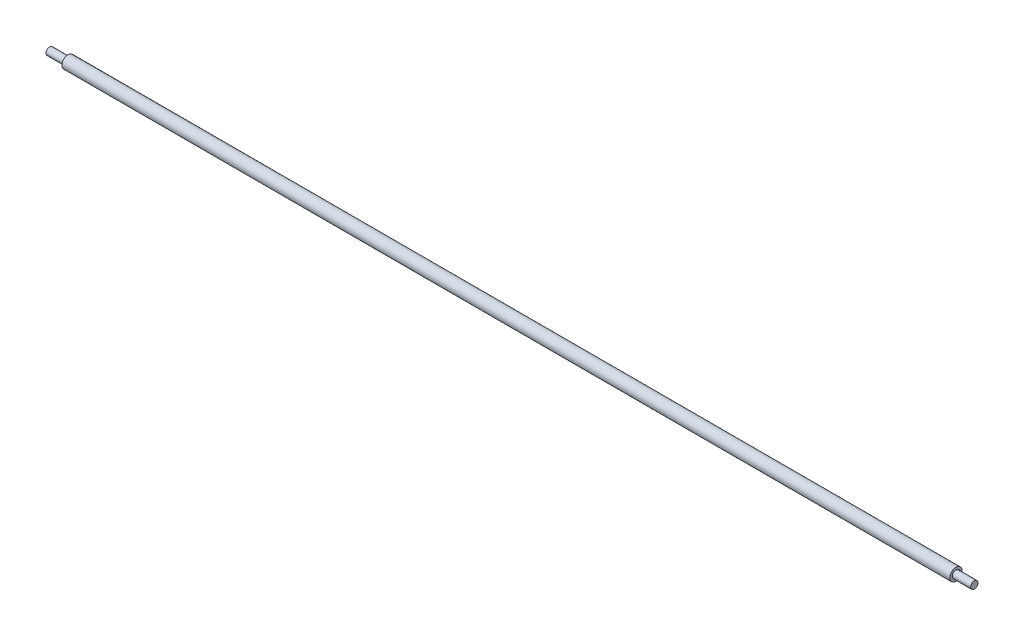
ISO-10303-21;
HEADER;
FILE_DESCRIPTION(('STEP AP214'),'2;1');
FILE_NAME('part.step','',(''),(''),'','','');
FILE_SCHEMA(('AUTOMOTIVE_DESIGN { 1 0 10303 214 1 1 1 1 }'));
ENDSEC;
DATA;
#1=APPLICATION_CONTEXT('core data for automotive mechanical design processes');
#2=APPLICATION_PROTOCOL_DEFINITION('international standard','automotive_design',2000,#1);
#3=PRODUCT_CONTEXT('',#1,'mechanical');
#4=PRODUCT('Part','Part','',(#3));
#5=PRODUCT_RELATED_PRODUCT_CATEGORY('part','',(#4));
#6=PRODUCT_DEFINITION_FORMATION('','',#4);
#7=PRODUCT_DEFINITION_CONTEXT('part definition',#1,'design');
#8=PRODUCT_DEFINITION('design','',#6,#7);
#9=PRODUCT_DEFINITION_SHAPE('','',#8);
#10=(LENGTH_UNIT() NAMED_UNIT(*) SI_UNIT(.MILLI.,.METRE.));
#11=(NAMED_UNIT(*) PLANE_ANGLE_UNIT() SI_UNIT($,.RADIAN.));
#12=(NAMED_UNIT(*) SI_UNIT($,.STERADIAN.) SOLID_ANGLE_UNIT());
#13=UNCERTAINTY_MEASURE_WITH_UNIT(LENGTH_MEASURE(1.E-05),#10,'distance_accuracy_value','');
#14=(GEOMETRIC_REPRESENTATION_CONTEXT(3) GLOBAL_UNCERTAINTY_ASSIGNED_CONTEXT((#13)) GLOBAL_UNIT_ASSIGNED_CONTEXT((#10,
#11,#12)) REPRESENTATION_CONTEXT('',''));
#15=CARTESIAN_POINT('',(0.,0.,0.));
#16=DIRECTION('',(0.,0.,1.));
#17=DIRECTION('',(1.,0.,0.));
#18=AXIS2_PLACEMENT_3D('',#15,#16,#17);
#19=CARTESIAN_POINT('',(-270.,0.,0.));
#20=DIRECTION('',(1.,0.,0.));
#21=DIRECTION('',(0.,0.,-1.));
#22=AXIS2_PLACEMENT_3D('',#19,#20,#21);
#23=CYLINDRICAL_SURFACE('',#22,5.);
#24=CARTESIAN_POINT('',(-270.,0.,0.));
#25=DIRECTION('',(1.,0.,0.));
#26=DIRECTION('',(0.,0.,-1.));
#27=AXIS2_PLACEMENT_3D('',#24,#25,#26);
#28=CIRCLE('',#27,5.);
#29=CARTESIAN_POINT('',(-270.,0.,-5.));
#30=VERTEX_POINT('',#29);
#31=EDGE_CURVE('E36',#30,#30,#28,.T.);
#32=ORIENTED_EDGE('',*,*,#31,.T.);
#33=EDGE_LOOP('',(#32));
#34=FACE_BOUND('',#33,.T.);
#35=CARTESIAN_POINT('',(455.,0.,0.));
#36=DIRECTION('',(1.,0.,0.));
#37=DIRECTION('',(0.,0.,-1.));
#38=AXIS2_PLACEMENT_3D('',#35,#36,#37);
#39=CIRCLE('',#38,5.);
#40=CARTESIAN_POINT('',(455.,0.,-5.));
#41=VERTEX_POINT('',#40);
#42=EDGE_CURVE('E51',#41,#41,#39,.T.);
#43=ORIENTED_EDGE('',*,*,#42,.F.);
#44=EDGE_LOOP('',(#43));
#45=FACE_BOUND('',#44,.T.);
#46=ADVANCED_FACE('F33',(#34,#45),#23,.T.);
#47=CARTESIAN_POINT('',(-270.,0.,0.));
#48=DIRECTION('',(1.,0.,0.));
#49=DIRECTION('',(0.,0.,-1.));
#50=AXIS2_PLACEMENT_3D('',#47,#48,#49);
#51=PLANE('',#50);
#52=CARTESIAN_POINT('',(-270.,0.,0.));
#53=DIRECTION('',(-1.,0.,0.));
#54=DIRECTION('',(0.,0.,1.));
#55=AXIS2_PLACEMENT_3D('',#52,#53,#54);
#56=CIRCLE('',#55,3.);
#57=CARTESIAN_POINT('',(-270.,0.,3.));
#58=VERTEX_POINT('',#57);
#59=EDGE_CURVE('E40',#58,#58,#56,.T.);
#60=ORIENTED_EDGE('',*,*,#59,.F.);
#61=EDGE_LOOP('',(#60));
#62=FACE_BOUND('',#61,.T.);
#63=ORIENTED_EDGE('',*,*,#31,.F.);
#64=EDGE_LOOP('',(#63));
#65=FACE_BOUND('',#64,.T.);
#66=ADVANCED_FACE('F60',(#62,#65),#51,.F.);
#67=CARTESIAN_POINT('',(455.,0.,0.));
#68=DIRECTION('',(1.,0.,0.));
#69=DIRECTION('',(0.,0.,-1.));
#70=AXIS2_PLACEMENT_3D('',#67,#68,#69);
#71=PLANE('',#70);
#72=CARTESIAN_POINT('',(455.,0.,0.));
#73=DIRECTION('',(1.,0.,0.));
#74=DIRECTION('',(0.,0.,-1.));
#75=AXIS2_PLACEMENT_3D('',#72,#73,#74);
#76=CIRCLE('',#75,3.);
#77=CARTESIAN_POINT('',(455.,0.,-3.));
#78=VERTEX_POINT('',#77);
#79=EDGE_CURVE('E10',#78,#78,#76,.T.);
#80=ORIENTED_EDGE('',*,*,#79,.F.);
#81=EDGE_LOOP('',(#80));
#82=FACE_BOUND('',#81,.T.);
#83=ORIENTED_EDGE('',*,*,#42,.T.);
#84=EDGE_LOOP('',(#83));
#85=FACE_BOUND('',#84,.T.);
#86=ADVANCED_FACE('F62',(#82,#85),#71,.T.);
#87=CARTESIAN_POINT('',(-285.,0.,0.));
#88=DIRECTION('',(1.,0.,0.));
#89=DIRECTION('',(0.,0.,-1.));
#90=AXIS2_PLACEMENT_3D('',#87,#88,#89);
#91=CYLINDRICAL_SURFACE('',#90,3.);
#92=CARTESIAN_POINT('',(-285.,0.,0.));
#93=DIRECTION('',(-1.,0.,0.));
#94=DIRECTION('',(0.,0.,1.));
#95=AXIS2_PLACEMENT_3D('',#92,#93,#94);
#96=CIRCLE('',#95,3.);
#97=CARTESIAN_POINT('',(-285.,0.,3.));
#98=VERTEX_POINT('',#97);
#99=EDGE_CURVE('E49',#98,#98,#96,.T.);
#100=ORIENTED_EDGE('',*,*,#99,.F.);
#101=EDGE_LOOP('',(#100));
#102=FACE_BOUND('',#101,.T.);
#103=ORIENTED_EDGE('',*,*,#59,.T.);
#104=EDGE_LOOP('',(#103));
#105=FACE_BOUND('',#104,.T.);
#106=ADVANCED_FACE('F68',(#102,#105),#91,.T.);
#107=CARTESIAN_POINT('',(-285.,0.,0.));
#108=DIRECTION('',(-1.,0.,0.));
#109=DIRECTION('',(0.,0.,1.));
#110=AXIS2_PLACEMENT_3D('',#107,#108,#109);
#111=PLANE('',#110);
#112=ORIENTED_EDGE('',*,*,#99,.T.);
#113=EDGE_LOOP('',(#112));
#114=FACE_BOUND('',#113,.T.);
#115=ADVANCED_FACE('F75',(#114),#111,.T.);
#116=CARTESIAN_POINT('',(470.,0.,0.));
#117=DIRECTION('',(-1.,0.,0.));
#118=DIRECTION('',(0.,0.,1.));
#119=AXIS2_PLACEMENT_3D('',#116,#117,#118);
#120=CYLINDRICAL_SURFACE('',#119,3.);
#121=CARTESIAN_POINT('',(470.,0.,0.));
#122=DIRECTION('',(1.,0.,0.));
#123=DIRECTION('',(0.,0.,-1.));
#124=AXIS2_PLACEMENT_3D('',#121,#122,#123);
#125=CIRCLE('',#124,3.);
#126=CARTESIAN_POINT('',(470.,0.,-3.));
#127=VERTEX_POINT('',#126);
#128=EDGE_CURVE('E48',#127,#127,#125,.T.);
#129=ORIENTED_EDGE('',*,*,#128,.F.);
#130=EDGE_LOOP('',(#129));
#131=FACE_BOUND('',#130,.T.);
#132=ORIENTED_EDGE('',*,*,#79,.T.);
#133=EDGE_LOOP('',(#132));
#134=FACE_BOUND('',#133,.T.);
#135=ADVANCED_FACE('F79',(#131,#134),#120,.T.);
#136=CARTESIAN_POINT('',(470.,0.,0.));
#137=DIRECTION('',(1.,0.,0.));
#138=DIRECTION('',(0.,0.,-1.));
#139=AXIS2_PLACEMENT_3D('',#136,#137,#138);
#140=PLANE('',#139);
#141=ORIENTED_EDGE('',*,*,#128,.T.);
#142=EDGE_LOOP('',(#141));
#143=FACE_BOUND('',#142,.T.);
#144=ADVANCED_FACE('F83',(#143),#140,.T.);
#145=CLOSED_SHELL('',(#46,#66,#86,#106,#115,#135,#144));
#146=MANIFOLD_SOLID_BREP('B2',#145);
#147=ADVANCED_BREP_SHAPE_REPRESENTATION('',(#18,#146),#14);
#148=SHAPE_DEFINITION_REPRESENTATION(#9,#147);
ENDSEC;
END-ISO-10303-21;
